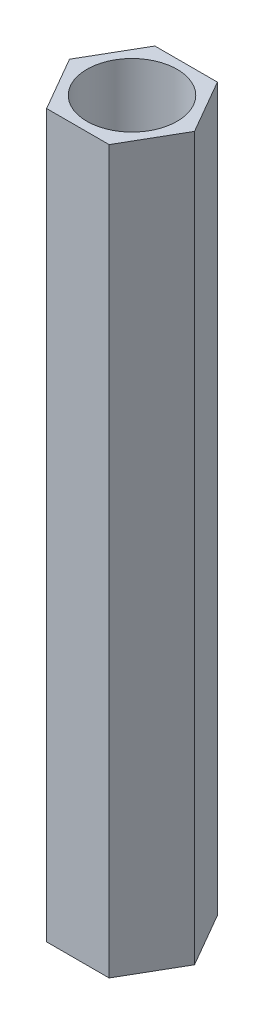
ISO-10303-21;
HEADER;
FILE_DESCRIPTION(('STEP AP214'),'2;1');
FILE_NAME('part.step','',(''),(''),'','','');
FILE_SCHEMA(('AUTOMOTIVE_DESIGN { 1 0 10303 214 1 1 1 1 }'));
ENDSEC;
DATA;
#1=APPLICATION_CONTEXT('core data for automotive mechanical design processes');
#2=APPLICATION_PROTOCOL_DEFINITION('international standard','automotive_design',2000,#1);
#3=PRODUCT_CONTEXT('',#1,'mechanical');
#4=PRODUCT('Part','Part','',(#3));
#5=PRODUCT_RELATED_PRODUCT_CATEGORY('part','',(#4));
#6=PRODUCT_DEFINITION_FORMATION('','',#4);
#7=PRODUCT_DEFINITION_CONTEXT('part definition',#1,'design');
#8=PRODUCT_DEFINITION('design','',#6,#7);
#9=PRODUCT_DEFINITION_SHAPE('','',#8);
#10=(LENGTH_UNIT() NAMED_UNIT(*) SI_UNIT(.MILLI.,.METRE.));
#11=(NAMED_UNIT(*) PLANE_ANGLE_UNIT() SI_UNIT($,.RADIAN.));
#12=(NAMED_UNIT(*) SI_UNIT($,.STERADIAN.) SOLID_ANGLE_UNIT());
#13=UNCERTAINTY_MEASURE_WITH_UNIT(LENGTH_MEASURE(1.E-05),#10,'distance_accuracy_value','');
#14=(GEOMETRIC_REPRESENTATION_CONTEXT(3) GLOBAL_UNCERTAINTY_ASSIGNED_CONTEXT((#13)) GLOBAL_UNIT_ASSIGNED_CONTEXT((#10,
#11,#12)) REPRESENTATION_CONTEXT('',''));
#15=CARTESIAN_POINT('',(0.,0.,0.));
#16=DIRECTION('',(0.,0.,1.));
#17=DIRECTION('',(1.,0.,0.));
#18=AXIS2_PLACEMENT_3D('',#15,#16,#17);
#19=CARTESIAN_POINT('',(0.,20.,0.));
#20=DIRECTION('',(0.,1.,0.));
#21=DIRECTION('',(0.,0.,1.));
#22=AXIS2_PLACEMENT_3D('',#19,#20,#21);
#23=PLANE('',#22);
#24=DIRECTION('',(-0.5,0.,-0.866025403784439));
#25=VECTOR('',#24,1.);
#26=CARTESIAN_POINT('',(3.46410161513776,20.,0.));
#27=LINE('',#26,#25);
#28=CARTESIAN_POINT('',(3.46410161513776,20.,0.));
#29=VERTEX_POINT('',#28);
#30=CARTESIAN_POINT('',(1.73205080756888,20.,-3.));
#31=VERTEX_POINT('',#30);
#32=EDGE_CURVE('E130',#29,#31,#27,.T.);
#33=ORIENTED_EDGE('',*,*,#32,.T.);
#34=DIRECTION('',(-1.,0.,0.));
#35=VECTOR('',#34,1.);
#36=CARTESIAN_POINT('',(1.73205080756888,20.,-3.));
#37=LINE('',#36,#35);
#38=CARTESIAN_POINT('',(-1.73205080756888,20.,-3.));
#39=VERTEX_POINT('',#38);
#40=EDGE_CURVE('E88',#31,#39,#37,.T.);
#41=ORIENTED_EDGE('',*,*,#40,.T.);
#42=DIRECTION('',(-0.5,0.,0.866025403784439));
#43=VECTOR('',#42,1.);
#44=CARTESIAN_POINT('',(-1.73205080756888,20.,-3.));
#45=LINE('',#44,#43);
#46=CARTESIAN_POINT('',(-3.46410161513775,20.,0.));
#47=VERTEX_POINT('',#46);
#48=EDGE_CURVE('E101',#39,#47,#45,.T.);
#49=ORIENTED_EDGE('',*,*,#48,.T.);
#50=DIRECTION('',(0.5,0.,0.866025403784439));
#51=VECTOR('',#50,1.);
#52=CARTESIAN_POINT('',(-3.46410161513775,20.,0.));
#53=LINE('',#52,#51);
#54=CARTESIAN_POINT('',(-1.73205080756887,20.,3.));
#55=VERTEX_POINT('',#54);
#56=EDGE_CURVE('E95',#47,#55,#53,.T.);
#57=ORIENTED_EDGE('',*,*,#56,.T.);
#58=DIRECTION('',(1.,0.,0.));
#59=VECTOR('',#58,1.);
#60=CARTESIAN_POINT('',(-1.73205080756887,20.,3.));
#61=LINE('',#60,#59);
#62=CARTESIAN_POINT('',(1.73205080756888,20.,3.));
#63=VERTEX_POINT('',#62);
#64=EDGE_CURVE('E99',#55,#63,#61,.T.);
#65=ORIENTED_EDGE('',*,*,#64,.T.);
#66=DIRECTION('',(0.5,0.,-0.866025403784439));
#67=VECTOR('',#66,1.);
#68=CARTESIAN_POINT('',(1.73205080756888,20.,3.));
#69=LINE('',#68,#67);
#70=EDGE_CURVE('E51',#63,#29,#69,.T.);
#71=ORIENTED_EDGE('',*,*,#70,.T.);
#72=EDGE_LOOP('',(#33,#41,#49,#57,#65,#71));
#73=FACE_BOUND('',#72,.T.);
#74=CARTESIAN_POINT('',(0.,20.,0.));
#75=DIRECTION('',(0.,1.,0.));
#76=DIRECTION('',(0.,0.,1.));
#77=AXIS2_PLACEMENT_3D('',#74,#75,#76);
#78=CIRCLE('',#77,2.5);
#79=CARTESIAN_POINT('',(0.,20.,2.5));
#80=VERTEX_POINT('',#79);
#81=EDGE_CURVE('E123',#80,#80,#78,.T.);
#82=ORIENTED_EDGE('',*,*,#81,.F.);
#83=EDGE_LOOP('',(#82));
#84=FACE_BOUND('',#83,.T.);
#85=ADVANCED_FACE('F34',(#73,#84),#23,.T.);
#86=CARTESIAN_POINT('',(0.,-20.,0.));
#87=DIRECTION('',(0.,1.,0.));
#88=DIRECTION('',(0.,0.,1.));
#89=AXIS2_PLACEMENT_3D('',#86,#87,#88);
#90=PLANE('',#89);
#91=DIRECTION('',(-0.5,0.,-0.866025403784439));
#92=VECTOR('',#91,1.);
#93=CARTESIAN_POINT('',(3.46410161513776,-20.,0.));
#94=LINE('',#93,#92);
#95=CARTESIAN_POINT('',(3.46410161513776,-20.,0.));
#96=VERTEX_POINT('',#95);
#97=CARTESIAN_POINT('',(1.73205080756888,-20.,-3.));
#98=VERTEX_POINT('',#97);
#99=EDGE_CURVE('E119',#96,#98,#94,.T.);
#100=ORIENTED_EDGE('',*,*,#99,.F.);
#101=DIRECTION('',(0.5,0.,-0.866025403784439));
#102=VECTOR('',#101,1.);
#103=CARTESIAN_POINT('',(1.73205080756888,-20.,3.));
#104=LINE('',#103,#102);
#105=CARTESIAN_POINT('',(1.73205080756888,-20.,3.));
#106=VERTEX_POINT('',#105);
#107=EDGE_CURVE('E80',#106,#96,#104,.T.);
#108=ORIENTED_EDGE('',*,*,#107,.F.);
#109=DIRECTION('',(1.,0.,0.));
#110=VECTOR('',#109,1.);
#111=CARTESIAN_POINT('',(-1.73205080756887,-20.,3.));
#112=LINE('',#111,#110);
#113=CARTESIAN_POINT('',(-1.73205080756887,-20.,3.));
#114=VERTEX_POINT('',#113);
#115=EDGE_CURVE('E74',#114,#106,#112,.T.);
#116=ORIENTED_EDGE('',*,*,#115,.F.);
#117=DIRECTION('',(0.5,0.,0.866025403784439));
#118=VECTOR('',#117,1.);
#119=CARTESIAN_POINT('',(-3.46410161513775,-20.,0.));
#120=LINE('',#119,#118);
#121=CARTESIAN_POINT('',(-3.46410161513775,-20.,0.));
#122=VERTEX_POINT('',#121);
#123=EDGE_CURVE('E109',#122,#114,#120,.T.);
#124=ORIENTED_EDGE('',*,*,#123,.F.);
#125=DIRECTION('',(-0.5,0.,0.866025403784439));
#126=VECTOR('',#125,1.);
#127=CARTESIAN_POINT('',(-1.73205080756888,-20.,-3.));
#128=LINE('',#127,#126);
#129=CARTESIAN_POINT('',(-1.73205080756888,-20.,-3.));
#130=VERTEX_POINT('',#129);
#131=EDGE_CURVE('E125',#130,#122,#128,.T.);
#132=ORIENTED_EDGE('',*,*,#131,.F.);
#133=DIRECTION('',(-1.,0.,0.));
#134=VECTOR('',#133,1.);
#135=CARTESIAN_POINT('',(1.73205080756888,-20.,-3.));
#136=LINE('',#135,#134);
#137=EDGE_CURVE('E122',#98,#130,#136,.T.);
#138=ORIENTED_EDGE('',*,*,#137,.F.);
#139=EDGE_LOOP('',(#100,#108,#116,#124,#132,#138));
#140=FACE_BOUND('',#139,.T.);
#141=CARTESIAN_POINT('',(0.,-20.,0.));
#142=DIRECTION('',(0.,1.,0.));
#143=DIRECTION('',(0.,0.,1.));
#144=AXIS2_PLACEMENT_3D('',#141,#142,#143);
#145=CIRCLE('',#144,2.5);
#146=CARTESIAN_POINT('',(0.,-20.,2.5));
#147=VERTEX_POINT('',#146);
#148=EDGE_CURVE('E223',#147,#147,#145,.T.);
#149=ORIENTED_EDGE('',*,*,#148,.T.);
#150=EDGE_LOOP('',(#149));
#151=FACE_BOUND('',#150,.T.);
#152=ADVANCED_FACE('F139',(#140,#151),#90,.F.);
#153=CARTESIAN_POINT('',(3.46410161513776,20.,0.));
#154=DIRECTION('',(-0.866025403784439,0.,0.5));
#155=DIRECTION('',(0.5,0.,0.866025403784439));
#156=AXIS2_PLACEMENT_3D('',#153,#154,#155);
#157=PLANE('',#156);
#158=ORIENTED_EDGE('',*,*,#99,.T.);
#159=DIRECTION('',(0.,-1.,0.));
#160=VECTOR('',#159,1.);
#161=CARTESIAN_POINT('',(1.73205080756888,20.,-3.));
#162=LINE('',#161,#160);
#163=EDGE_CURVE('E11',#31,#98,#162,.T.);
#164=ORIENTED_EDGE('',*,*,#163,.F.);
#165=ORIENTED_EDGE('',*,*,#32,.F.);
#166=DIRECTION('',(0.,-1.,0.));
#167=VECTOR('',#166,1.);
#168=CARTESIAN_POINT('',(3.46410161513776,20.,0.));
#169=LINE('',#168,#167);
#170=EDGE_CURVE('E115',#29,#96,#169,.T.);
#171=ORIENTED_EDGE('',*,*,#170,.T.);
#172=EDGE_LOOP('',(#158,#164,#165,#171));
#173=FACE_BOUND('',#172,.T.);
#174=ADVANCED_FACE('F36',(#173),#157,.F.);
#175=CARTESIAN_POINT('',(1.73205080756888,20.,-3.));
#176=DIRECTION('',(0.,0.,1.));
#177=DIRECTION('',(1.,0.,0.));
#178=AXIS2_PLACEMENT_3D('',#175,#176,#177);
#179=PLANE('',#178);
#180=ORIENTED_EDGE('',*,*,#137,.T.);
#181=DIRECTION('',(0.,-1.,0.));
#182=VECTOR('',#181,1.);
#183=CARTESIAN_POINT('',(-1.73205080756888,20.,-3.));
#184=LINE('',#183,#182);
#185=EDGE_CURVE('E43',#39,#130,#184,.T.);
#186=ORIENTED_EDGE('',*,*,#185,.F.);
#187=ORIENTED_EDGE('',*,*,#40,.F.);
#188=ORIENTED_EDGE('',*,*,#163,.T.);
#189=EDGE_LOOP('',(#180,#186,#187,#188));
#190=FACE_BOUND('',#189,.T.);
#191=ADVANCED_FACE('F164',(#190),#179,.F.);
#192=CARTESIAN_POINT('',(-1.73205080756888,20.,-3.));
#193=DIRECTION('',(0.866025403784439,0.,0.5));
#194=DIRECTION('',(0.5,0.,-0.866025403784439));
#195=AXIS2_PLACEMENT_3D('',#192,#193,#194);
#196=PLANE('',#195);
#197=ORIENTED_EDGE('',*,*,#131,.T.);
#198=DIRECTION('',(0.,-1.,0.));
#199=VECTOR('',#198,1.);
#200=CARTESIAN_POINT('',(-3.46410161513775,20.,0.));
#201=LINE('',#200,#199);
#202=EDGE_CURVE('E110',#47,#122,#201,.T.);
#203=ORIENTED_EDGE('',*,*,#202,.F.);
#204=ORIENTED_EDGE('',*,*,#48,.F.);
#205=ORIENTED_EDGE('',*,*,#185,.T.);
#206=EDGE_LOOP('',(#197,#203,#204,#205));
#207=FACE_BOUND('',#206,.T.);
#208=ADVANCED_FACE('F136',(#207),#196,.F.);
#209=CARTESIAN_POINT('',(-3.46410161513775,20.,0.));
#210=DIRECTION('',(0.866025403784439,0.,-0.5));
#211=DIRECTION('',(-0.5,0.,-0.866025403784439));
#212=AXIS2_PLACEMENT_3D('',#209,#210,#211);
#213=PLANE('',#212);
#214=ORIENTED_EDGE('',*,*,#123,.T.);
#215=DIRECTION('',(0.,-1.,0.));
#216=VECTOR('',#215,1.);
#217=CARTESIAN_POINT('',(-1.73205080756887,20.,3.));
#218=LINE('',#217,#216);
#219=EDGE_CURVE('E106',#55,#114,#218,.T.);
#220=ORIENTED_EDGE('',*,*,#219,.F.);
#221=ORIENTED_EDGE('',*,*,#56,.F.);
#222=ORIENTED_EDGE('',*,*,#202,.T.);
#223=EDGE_LOOP('',(#214,#220,#221,#222));
#224=FACE_BOUND('',#223,.T.);
#225=ADVANCED_FACE('F107',(#224),#213,.F.);
#226=CARTESIAN_POINT('',(-1.73205080756887,20.,3.));
#227=DIRECTION('',(0.,0.,-1.));
#228=DIRECTION('',(-1.,0.,0.));
#229=AXIS2_PLACEMENT_3D('',#226,#227,#228);
#230=PLANE('',#229);
#231=ORIENTED_EDGE('',*,*,#115,.T.);
#232=DIRECTION('',(0.,-1.,0.));
#233=VECTOR('',#232,1.);
#234=CARTESIAN_POINT('',(1.73205080756888,20.,3.));
#235=LINE('',#234,#233);
#236=EDGE_CURVE('E111',#63,#106,#235,.T.);
#237=ORIENTED_EDGE('',*,*,#236,.F.);
#238=ORIENTED_EDGE('',*,*,#64,.F.);
#239=ORIENTED_EDGE('',*,*,#219,.T.);
#240=EDGE_LOOP('',(#231,#237,#238,#239));
#241=FACE_BOUND('',#240,.T.);
#242=ADVANCED_FACE('F113',(#241),#230,.F.);
#243=CARTESIAN_POINT('',(1.73205080756888,20.,3.));
#244=DIRECTION('',(-0.866025403784439,0.,-0.5));
#245=DIRECTION('',(-0.5,0.,0.866025403784439));
#246=AXIS2_PLACEMENT_3D('',#243,#244,#245);
#247=PLANE('',#246);
#248=ORIENTED_EDGE('',*,*,#107,.T.);
#249=ORIENTED_EDGE('',*,*,#170,.F.);
#250=ORIENTED_EDGE('',*,*,#70,.F.);
#251=ORIENTED_EDGE('',*,*,#236,.T.);
#252=EDGE_LOOP('',(#248,#249,#250,#251));
#253=FACE_BOUND('',#252,.T.);
#254=ADVANCED_FACE('F144',(#253),#247,.F.);
#255=CARTESIAN_POINT('',(0.,20.,0.));
#256=DIRECTION('',(0.,-1.,0.));
#257=DIRECTION('',(0.,0.,-1.));
#258=AXIS2_PLACEMENT_3D('',#255,#256,#257);
#259=CYLINDRICAL_SURFACE('',#258,2.5);
#260=ORIENTED_EDGE('',*,*,#81,.T.);
#261=EDGE_LOOP('',(#260));
#262=FACE_BOUND('',#261,.T.);
#263=ORIENTED_EDGE('',*,*,#148,.F.);
#264=EDGE_LOOP('',(#263));
#265=FACE_BOUND('',#264,.T.);
#266=ADVANCED_FACE('F146',(#262,#265),#259,.F.);
#267=CLOSED_SHELL('',(#85,#152,#174,#191,#208,#225,#242,#254,#266));
#268=MANIFOLD_SOLID_BREP('B2',#267);
#269=ADVANCED_BREP_SHAPE_REPRESENTATION('',(#18,#268),#14);
#270=SHAPE_DEFINITION_REPRESENTATION(#9,#269);
ENDSEC;
END-ISO-10303-21;
